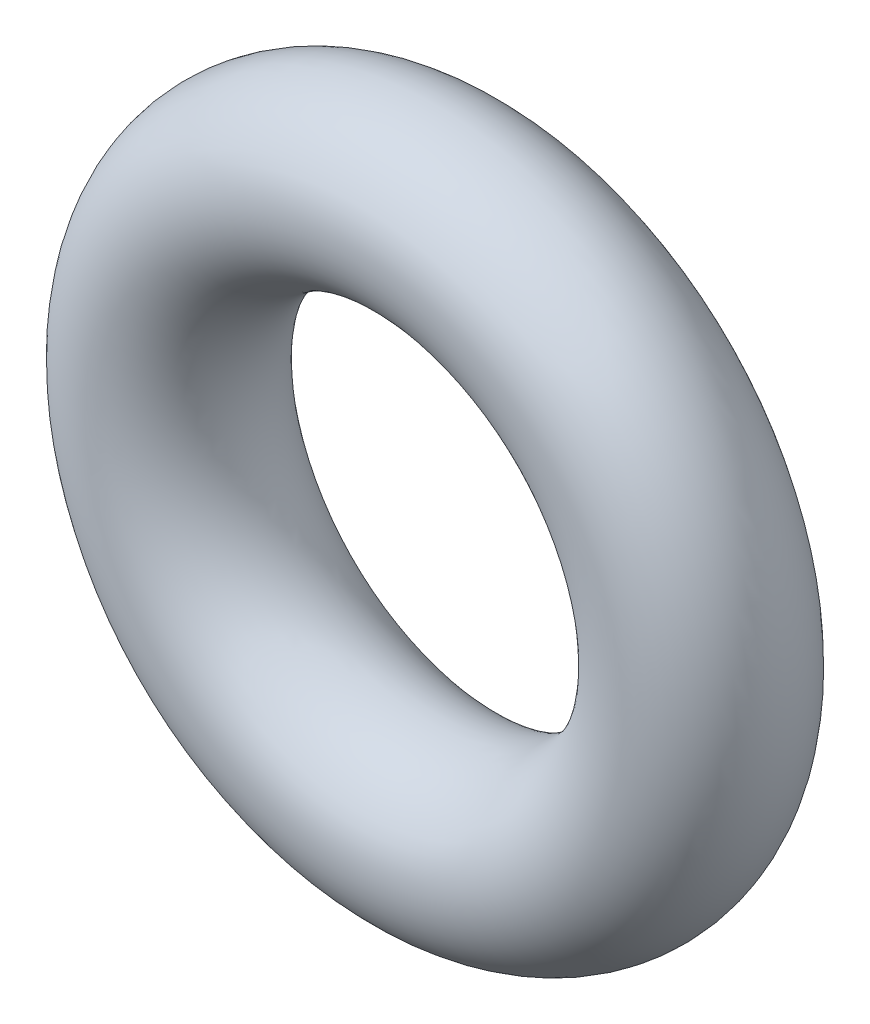
ISO-10303-21;
HEADER;
FILE_DESCRIPTION(('STEP AP214'),'2;1');
FILE_NAME('part.step','',(''),(''),'','','');
FILE_SCHEMA(('AUTOMOTIVE_DESIGN { 1 0 10303 214 1 1 1 1 }'));
ENDSEC;
DATA;
#1=APPLICATION_CONTEXT('core data for automotive mechanical design processes');
#2=APPLICATION_PROTOCOL_DEFINITION('international standard','automotive_design',2000,#1);
#3=PRODUCT_CONTEXT('',#1,'mechanical');
#4=PRODUCT('Part','Part','',(#3));
#5=PRODUCT_RELATED_PRODUCT_CATEGORY('part','',(#4));
#6=PRODUCT_DEFINITION_FORMATION('','',#4);
#7=PRODUCT_DEFINITION_CONTEXT('part definition',#1,'design');
#8=PRODUCT_DEFINITION('design','',#6,#7);
#9=PRODUCT_DEFINITION_SHAPE('','',#8);
#10=(LENGTH_UNIT() NAMED_UNIT(*) SI_UNIT(.MILLI.,.METRE.));
#11=(NAMED_UNIT(*) PLANE_ANGLE_UNIT() SI_UNIT($,.RADIAN.));
#12=(NAMED_UNIT(*) SI_UNIT($,.STERADIAN.) SOLID_ANGLE_UNIT());
#13=UNCERTAINTY_MEASURE_WITH_UNIT(LENGTH_MEASURE(1.E-05),#10,'distance_accuracy_value','');
#14=(GEOMETRIC_REPRESENTATION_CONTEXT(3) GLOBAL_UNCERTAINTY_ASSIGNED_CONTEXT((#13)) GLOBAL_UNIT_ASSIGNED_CONTEXT((#10,
#11,#12)) REPRESENTATION_CONTEXT('',''));
#15=CARTESIAN_POINT('',(0.,0.,0.));
#16=DIRECTION('',(0.,0.,1.));
#17=DIRECTION('',(1.,0.,0.));
#18=AXIS2_PLACEMENT_3D('',#15,#16,#17);
#19=CARTESIAN_POINT('',(0.,0.,0.));
#20=DIRECTION('',(0.,0.,1.));
#21=DIRECTION('',(1.,0.,0.));
#22=AXIS2_PLACEMENT_3D('',#19,#20,#21);
#23=TOROIDAL_SURFACE('',#22,2.7305,0.889000000000003);
#24=CARTESIAN_POINT('',(3.6195,0.,0.));
#25=VERTEX_POINT('',#24);
#26=VERTEX_LOOP('',#25);
#27=FACE_BOUND('',#26,.T.);
#28=ADVANCED_FACE('F37',(#27),#23,.T.);
#29=CLOSED_SHELL('',(#28));
#30=MANIFOLD_SOLID_BREP('B2',#29);
#31=ADVANCED_BREP_SHAPE_REPRESENTATION('',(#18,#30),#14);
#32=SHAPE_DEFINITION_REPRESENTATION(#9,#31);
ENDSEC;
END-ISO-10303-21;
